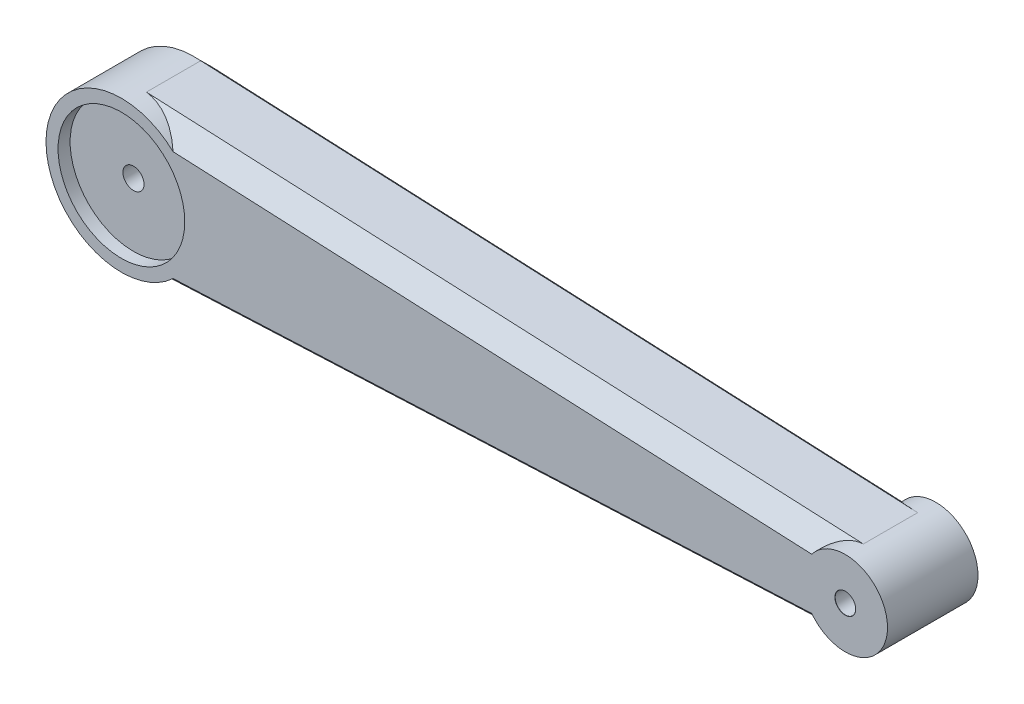
ISO-10303-21;
HEADER;
FILE_DESCRIPTION(('STEP AP214'),'2;1');
FILE_NAME('part.step','',(''),(''),'','','');
FILE_SCHEMA(('AUTOMOTIVE_DESIGN { 1 0 10303 214 1 1 1 1 }'));
ENDSEC;
DATA;
#1=APPLICATION_CONTEXT('core data for automotive mechanical design processes');
#2=APPLICATION_PROTOCOL_DEFINITION('international standard','automotive_design',2000,#1);
#3=PRODUCT_CONTEXT('',#1,'mechanical');
#4=PRODUCT('Part','Part','',(#3));
#5=PRODUCT_RELATED_PRODUCT_CATEGORY('part','',(#4));
#6=PRODUCT_DEFINITION_FORMATION('','',#4);
#7=PRODUCT_DEFINITION_CONTEXT('part definition',#1,'design');
#8=PRODUCT_DEFINITION('design','',#6,#7);
#9=PRODUCT_DEFINITION_SHAPE('','',#8);
#10=(LENGTH_UNIT() NAMED_UNIT(*) SI_UNIT(.MILLI.,.METRE.));
#11=(NAMED_UNIT(*) PLANE_ANGLE_UNIT() SI_UNIT($,.RADIAN.));
#12=(NAMED_UNIT(*) SI_UNIT($,.STERADIAN.) SOLID_ANGLE_UNIT());
#13=UNCERTAINTY_MEASURE_WITH_UNIT(LENGTH_MEASURE(1.E-05),#10,'distance_accuracy_value','');
#14=(GEOMETRIC_REPRESENTATION_CONTEXT(3) GLOBAL_UNCERTAINTY_ASSIGNED_CONTEXT((#13)) GLOBAL_UNIT_ASSIGNED_CONTEXT((#10,
#11,#12)) REPRESENTATION_CONTEXT('',''));
#15=CARTESIAN_POINT('',(0.,0.,0.));
#16=DIRECTION('',(0.,0.,1.));
#17=DIRECTION('',(1.,0.,0.));
#18=AXIS2_PLACEMENT_3D('',#15,#16,#17);
#19=CARTESIAN_POINT('',(0.,0.,15.));
#20=DIRECTION('',(0.,0.,-1.));
#21=DIRECTION('',(-1.,0.,0.));
#22=AXIS2_PLACEMENT_3D('',#19,#20,#21);
#23=CYLINDRICAL_SURFACE('',#22,12.5);
#24=CARTESIAN_POINT('',(0.,0.,15.));
#25=DIRECTION('',(0.,0.,1.));
#26=DIRECTION('',(1.,0.,0.));
#27=AXIS2_PLACEMENT_3D('',#24,#25,#26);
#28=CIRCLE('',#27,12.5);
#29=CARTESIAN_POINT('',(8.56516648559652,9.10428048085154,15.));
#30=VERTEX_POINT('',#29);
#31=CARTESIAN_POINT('',(8.56516648559648,-9.10428048085156,15.));
#32=VERTEX_POINT('',#31);
#33=EDGE_CURVE('E296',#30,#32,#28,.T.);
#34=ORIENTED_EDGE('',*,*,#33,.F.);
#35=CARTESIAN_POINT('',(0.,0.,24.4868913091261));
#36=DIRECTION('',(0.0323750735756157,0.706365241649797,0.707106781186546));
#37=DIRECTION('',(0.0323750735756155,0.706365241649794,-0.707106781186549));
#38=AXIS2_PLACEMENT_3D('',#35,#36,#37);
#39=ELLIPSE('',#38,17.6776695296637,12.5);
#40=CARTESIAN_POINT('',(1.14343133348353,12.4475927305487,12.));
#41=VERTEX_POINT('',#40);
#42=EDGE_CURVE('E52',#30,#41,#39,.T.);
#43=ORIENTED_EDGE('',*,*,#42,.T.);
#44=DIRECTION('',(0.,0.,-1.));
#45=VECTOR('',#44,1.);
#46=CARTESIAN_POINT('',(1.14343133348353,12.4475927305487,15.));
#47=LINE('',#46,#45);
#48=CARTESIAN_POINT('',(1.14343133348353,12.4475927305487,3.));
#49=VERTEX_POINT('',#48);
#50=EDGE_CURVE('E303',#41,#49,#47,.T.);
#51=ORIENTED_EDGE('',*,*,#50,.T.);
#52=CARTESIAN_POINT('',(0.,0.,3.));
#53=DIRECTION('',(0.,0.,1.));
#54=DIRECTION('',(1.,0.,0.));
#55=AXIS2_PLACEMENT_3D('',#52,#53,#54);
#56=CIRCLE('',#55,12.5);
#57=CARTESIAN_POINT('',(1.14343133348353,-12.4475927305487,3.));
#58=VERTEX_POINT('',#57);
#59=EDGE_CURVE('E149',#49,#58,#56,.T.);
#60=ORIENTED_EDGE('',*,*,#59,.T.);
#61=DIRECTION('',(0.,0.,-1.));
#62=VECTOR('',#61,1.);
#63=CARTESIAN_POINT('',(1.14343133348353,-12.4475927305487,15.));
#64=LINE('',#63,#62);
#65=CARTESIAN_POINT('',(1.14343133348353,-12.4475927305487,12.));
#66=VERTEX_POINT('',#65);
#67=EDGE_CURVE('E119',#66,#58,#64,.T.);
#68=ORIENTED_EDGE('',*,*,#67,.F.);
#69=CARTESIAN_POINT('',(0.,0.,24.4868913091262));
#70=DIRECTION('',(0.0323750735756157,-0.706365241649798,0.707106781186545));
#71=DIRECTION('',(0.0323750735756155,-0.706365241649792,-0.707106781186551));
#72=AXIS2_PLACEMENT_3D('',#69,#70,#71);
#73=ELLIPSE('',#72,17.6776695296638,12.5);
#74=EDGE_CURVE('E327',#66,#32,#73,.T.);
#75=ORIENTED_EDGE('',*,*,#74,.T.);
#76=EDGE_LOOP('',(#34,#43,#51,#60,#68,#75));
#77=FACE_BOUND('',#76,.T.);
#78=ADVANCED_FACE('F41',(#77),#23,.T.);
#79=CARTESIAN_POINT('',(1.14343133348353,-12.4475927305487,15.));
#80=DIRECTION('',(-0.0457852681334624,0.998951304730089,0.));
#81=DIRECTION('',(-0.998951304730089,-0.0457852681334624,0.));
#82=AXIS2_PLACEMENT_3D('',#79,#80,#81);
#83=PLANE('',#82);
#84=DIRECTION('',(0.,0.,-1.));
#85=VECTOR('',#84,1.);
#86=CARTESIAN_POINT('',(120.,-7.,15.));
#87=LINE('',#86,#85);
#88=CARTESIAN_POINT('',(120.,-7.,12.));
#89=VERTEX_POINT('',#88);
#90=CARTESIAN_POINT('',(120.,-7.,3.00000000000002));
#91=VERTEX_POINT('',#90);
#92=EDGE_CURVE('E108',#89,#91,#87,.T.);
#93=ORIENTED_EDGE('',*,*,#92,.F.);
#94=DIRECTION('',(-0.998951304730089,-0.0457852681334624,0.));
#95=VECTOR('',#94,1.);
#96=CARTESIAN_POINT('',(1.14343133348353,-12.4475927305487,12.));
#97=LINE('',#96,#95);
#98=EDGE_CURVE('E323',#89,#66,#97,.T.);
#99=ORIENTED_EDGE('',*,*,#98,.T.);
#100=ORIENTED_EDGE('',*,*,#67,.T.);
#101=DIRECTION('',(0.998951304730089,0.0457852681334624,0.));
#102=VECTOR('',#101,1.);
#103=CARTESIAN_POINT('',(1.14343133348353,-12.4475927305487,3.00000000000002));
#104=LINE('',#103,#102);
#105=EDGE_CURVE('E126',#58,#91,#104,.T.);
#106=ORIENTED_EDGE('',*,*,#105,.T.);
#107=EDGE_LOOP('',(#93,#99,#100,#106));
#108=FACE_BOUND('',#107,.T.);
#109=ADVANCED_FACE('F132',(#108),#83,.F.);
#110=CARTESIAN_POINT('',(120.,0.,15.));
#111=DIRECTION('',(0.,0.,-1.));
#112=DIRECTION('',(-1.,0.,0.));
#113=AXIS2_PLACEMENT_3D('',#110,#111,#112);
#114=CYLINDRICAL_SURFACE('',#113,7.);
#115=CARTESIAN_POINT('',(120.,0.,0.));
#116=DIRECTION('',(0.,0.,1.));
#117=DIRECTION('',(1.,0.,0.));
#118=AXIS2_PLACEMENT_3D('',#115,#116,#117);
#119=CIRCLE('',#118,7.);
#120=CARTESIAN_POINT('',(114.439167405954,-4.25172210533514,0.));
#121=VERTEX_POINT('',#120);
#122=CARTESIAN_POINT('',(114.439167405954,4.25172210533514,0.));
#123=VERTEX_POINT('',#122);
#124=EDGE_CURVE('E300',#121,#123,#119,.T.);
#125=ORIENTED_EDGE('',*,*,#124,.T.);
#126=CARTESIAN_POINT('',(120.,0.,-3.99265913311058));
#127=DIRECTION('',(-0.0323750735756155,-0.706365241649793,0.707106781186549));
#128=DIRECTION('',(-0.0323750735756157,-0.706365241649797,-0.707106781186546));
#129=AXIS2_PLACEMENT_3D('',#126,#127,#128);
#130=ELLIPSE('',#129,9.89949493661164,7.);
#131=CARTESIAN_POINT('',(120.,7.,3.));
#132=VERTEX_POINT('',#131);
#133=EDGE_CURVE('E129',#123,#132,#130,.F.);
#134=ORIENTED_EDGE('',*,*,#133,.T.);
#135=DIRECTION('',(0.,0.,-1.));
#136=VECTOR('',#135,1.);
#137=CARTESIAN_POINT('',(120.,7.,15.));
#138=LINE('',#137,#136);
#139=CARTESIAN_POINT('',(120.,7.,12.));
#140=VERTEX_POINT('',#139);
#141=EDGE_CURVE('E120',#140,#132,#138,.T.);
#142=ORIENTED_EDGE('',*,*,#141,.F.);
#143=CARTESIAN_POINT('',(120.,0.,18.9926591331106));
#144=DIRECTION('',(0.0323750735756157,0.706365241649797,0.707106781186546));
#145=DIRECTION('',(0.0323750735756155,0.706365241649794,-0.707106781186549));
#146=AXIS2_PLACEMENT_3D('',#143,#144,#145);
#147=ELLIPSE('',#146,9.89949493661168,7.);
#148=CARTESIAN_POINT('',(114.439167405954,4.25172210533516,15.));
#149=VERTEX_POINT('',#148);
#150=EDGE_CURVE('E11',#140,#149,#147,.T.);
#151=ORIENTED_EDGE('',*,*,#150,.T.);
#152=CARTESIAN_POINT('',(120.,0.,15.));
#153=DIRECTION('',(0.,0.,1.));
#154=DIRECTION('',(1.,0.,0.));
#155=AXIS2_PLACEMENT_3D('',#152,#153,#154);
#156=CIRCLE('',#155,7.);
#157=CARTESIAN_POINT('',(114.439167405954,-4.25172210533518,15.));
#158=VERTEX_POINT('',#157);
#159=EDGE_CURVE('E299',#158,#149,#156,.T.);
#160=ORIENTED_EDGE('',*,*,#159,.F.);
#161=CARTESIAN_POINT('',(120.,0.,18.9926591331107));
#162=DIRECTION('',(0.0323750735756157,-0.706365241649798,0.707106781186545));
#163=DIRECTION('',(0.0323750735756155,-0.706365241649792,-0.707106781186551));
#164=AXIS2_PLACEMENT_3D('',#161,#162,#163);
#165=ELLIPSE('',#164,9.8994949366117,7.);
#166=EDGE_CURVE('E114',#158,#89,#165,.T.);
#167=ORIENTED_EDGE('',*,*,#166,.T.);
#168=ORIENTED_EDGE('',*,*,#92,.T.);
#169=CARTESIAN_POINT('',(120.,0.,-3.9926591331106));
#170=DIRECTION('',(-0.0323750735756156,0.706365241649795,0.707106781186547));
#171=DIRECTION('',(-0.0323750735756156,0.706365241649795,-0.707106781186548));
#172=AXIS2_PLACEMENT_3D('',#169,#170,#171);
#173=ELLIPSE('',#172,9.89949493661167,7.);
#174=EDGE_CURVE('E111',#91,#121,#173,.F.);
#175=ORIENTED_EDGE('',*,*,#174,.T.);
#176=EDGE_LOOP('',(#125,#134,#142,#151,#160,#167,#168,#175));
#177=FACE_BOUND('',#176,.T.);
#178=ADVANCED_FACE('F110',(#177),#114,.T.);
#179=CARTESIAN_POINT('',(1.14343133348353,12.4475927305487,15.));
#180=DIRECTION('',(-0.0457852681334624,-0.998951304730089,0.));
#181=DIRECTION('',(0.998951304730089,-0.0457852681334624,0.));
#182=AXIS2_PLACEMENT_3D('',#179,#180,#181);
#183=PLANE('',#182);
#184=ORIENTED_EDGE('',*,*,#50,.F.);
#185=DIRECTION('',(0.998951304730089,-0.0457852681334624,0.));
#186=VECTOR('',#185,1.);
#187=CARTESIAN_POINT('',(120.,7.,12.));
#188=LINE('',#187,#186);
#189=EDGE_CURVE('E65',#41,#140,#188,.T.);
#190=ORIENTED_EDGE('',*,*,#189,.T.);
#191=ORIENTED_EDGE('',*,*,#141,.T.);
#192=DIRECTION('',(-0.998951304730089,0.0457852681334624,0.));
#193=VECTOR('',#192,1.);
#194=CARTESIAN_POINT('',(1.14343133348353,12.4475927305487,3.));
#195=LINE('',#194,#193);
#196=EDGE_CURVE('E130',#132,#49,#195,.T.);
#197=ORIENTED_EDGE('',*,*,#196,.T.);
#198=EDGE_LOOP('',(#184,#190,#191,#197));
#199=FACE_BOUND('',#198,.T.);
#200=ADVANCED_FACE('F220',(#199),#183,.F.);
#201=CARTESIAN_POINT('',(0.,0.,15.));
#202=DIRECTION('',(0.,0.,1.));
#203=DIRECTION('',(1.,0.,0.));
#204=AXIS2_PLACEMENT_3D('',#201,#202,#203);
#205=PLANE('',#204);
#206=CARTESIAN_POINT('',(120.,0.,15.));
#207=DIRECTION('',(0.,0.,1.));
#208=DIRECTION('',(1.,0.,0.));
#209=AXIS2_PLACEMENT_3D('',#206,#207,#208);
#210=CIRCLE('',#209,1.725);
#211=CARTESIAN_POINT('',(121.725,0.,15.));
#212=VERTEX_POINT('',#211);
#213=EDGE_CURVE('E277',#212,#212,#210,.T.);
#214=ORIENTED_EDGE('',*,*,#213,.F.);
#215=EDGE_LOOP('',(#214));
#216=FACE_BOUND('',#215,.T.);
#217=CARTESIAN_POINT('',(0.,0.,15.));
#218=DIRECTION('',(0.,0.,1.));
#219=DIRECTION('',(1.,0.,0.));
#220=AXIS2_PLACEMENT_3D('',#217,#218,#219);
#221=CIRCLE('',#220,10.5);
#222=CARTESIAN_POINT('',(10.5,0.,15.));
#223=VERTEX_POINT('',#222);
#224=EDGE_CURVE('E289',#223,#223,#221,.T.);
#225=ORIENTED_EDGE('',*,*,#224,.F.);
#226=EDGE_LOOP('',(#225));
#227=FACE_BOUND('',#226,.T.);
#228=DIRECTION('',(0.998951304730089,0.0457852681334624,0.));
#229=VECTOR('',#228,1.);
#230=CARTESIAN_POINT('',(119.8626441956,-4.00314608580976,15.));
#231=LINE('',#230,#229);
#232=EDGE_CURVE('E329',#32,#158,#231,.T.);
#233=ORIENTED_EDGE('',*,*,#232,.T.);
#234=ORIENTED_EDGE('',*,*,#159,.T.);
#235=DIRECTION('',(-0.998951304730089,0.0457852681334624,0.));
#236=VECTOR('',#235,1.);
#237=CARTESIAN_POINT('',(1.00607552908314,9.4507388163584,15.));
#238=LINE('',#237,#236);
#239=EDGE_CURVE('E158',#149,#30,#238,.T.);
#240=ORIENTED_EDGE('',*,*,#239,.T.);
#241=ORIENTED_EDGE('',*,*,#33,.T.);
#242=EDGE_LOOP('',(#233,#234,#240,#241));
#243=FACE_BOUND('',#242,.T.);
#244=ADVANCED_FACE('F223',(#216,#227,#243),#205,.T.);
#245=CARTESIAN_POINT('',(0.,0.,0.));
#246=DIRECTION('',(0.,0.,1.));
#247=DIRECTION('',(1.,0.,0.));
#248=AXIS2_PLACEMENT_3D('',#245,#246,#247);
#249=PLANE('',#248);
#250=CARTESIAN_POINT('',(0.,0.,0.));
#251=DIRECTION('',(0.,0.,-1.));
#252=DIRECTION('',(-1.,0.,0.));
#253=AXIS2_PLACEMENT_3D('',#250,#251,#252);
#254=CIRCLE('',#253,6.145);
#255=CARTESIAN_POINT('',(-6.145,0.,0.));
#256=VERTEX_POINT('',#255);
#257=EDGE_CURVE('E263',#256,#256,#254,.T.);
#258=ORIENTED_EDGE('',*,*,#257,.F.);
#259=EDGE_LOOP('',(#258));
#260=FACE_BOUND('',#259,.T.);
#261=CARTESIAN_POINT('',(120.,0.,0.));
#262=DIRECTION('',(0.,0.,1.));
#263=DIRECTION('',(1.,0.,0.));
#264=AXIS2_PLACEMENT_3D('',#261,#262,#263);
#265=CIRCLE('',#264,1.69999999999999);
#266=CARTESIAN_POINT('',(121.7,0.,0.));
#267=VERTEX_POINT('',#266);
#268=EDGE_CURVE('E285',#267,#267,#265,.T.);
#269=ORIENTED_EDGE('',*,*,#268,.T.);
#270=EDGE_LOOP('',(#269));
#271=FACE_BOUND('',#270,.T.);
#272=ORIENTED_EDGE('',*,*,#124,.F.);
#273=DIRECTION('',(-0.998951304730089,-0.0457852681334624,0.));
#274=VECTOR('',#273,1.);
#275=CARTESIAN_POINT('',(0.434359862341352,-9.47694245108405,0.));
#276=LINE('',#275,#274);
#277=CARTESIAN_POINT('',(0.932728737895797,-9.4541005442878,0.));
#278=VERTEX_POINT('',#277);
#279=EDGE_CURVE('E127',#121,#278,#276,.T.);
#280=ORIENTED_EDGE('',*,*,#279,.T.);
#281=CARTESIAN_POINT('',(0.,0.,0.));
#282=DIRECTION('',(0.,0.,1.));
#283=DIRECTION('',(1.,0.,0.));
#284=AXIS2_PLACEMENT_3D('',#281,#282,#283);
#285=CIRCLE('',#284,9.49999999999998);
#286=CARTESIAN_POINT('',(0.932728737895815,9.4541005442878,0.));
#287=VERTEX_POINT('',#286);
#288=EDGE_CURVE('E141',#278,#287,#285,.F.);
#289=ORIENTED_EDGE('',*,*,#288,.T.);
#290=DIRECTION('',(0.998951304730089,-0.0457852681334624,0.));
#291=VECTOR('',#290,1.);
#292=CARTESIAN_POINT('',(0.434359862341352,9.47694245108405,0.));
#293=LINE('',#292,#291);
#294=EDGE_CURVE('E136',#287,#123,#293,.T.);
#295=ORIENTED_EDGE('',*,*,#294,.T.);
#296=EDGE_LOOP('',(#272,#280,#289,#295));
#297=FACE_BOUND('',#296,.T.);
#298=ADVANCED_FACE('F193',(#260,#271,#297),#249,.F.);
#299=CARTESIAN_POINT('',(1.14343133348353,12.4475927305487,3.));
#300=DIRECTION('',(-0.0323750735756155,-0.706365241649793,0.707106781186549));
#301=DIRECTION('',(-0.998951304730089,0.0457852681334624,0.));
#302=AXIS2_PLACEMENT_3D('',#299,#300,#301);
#303=PLANE('',#302);
#304=ORIENTED_EDGE('',*,*,#133,.F.);
#305=ORIENTED_EDGE('',*,*,#294,.F.);
#306=CARTESIAN_POINT('',(0.932728737895815,9.4541005442878,0.));
#307=CARTESIAN_POINT('',(0.968682039138254,9.95296734663903,0.499989774632951));
#308=CARTESIAN_POINT('',(1.00421724021303,10.4518584419565,0.999984673927899));
#309=CARTESIAN_POINT('',(1.07445143866215,11.4496891707147,1.99998467392888));
#310=CARTESIAN_POINT('',(1.10915043611661,11.9486288041509,2.49998977463393));
#311=CARTESIAN_POINT('',(1.14343133348354,12.4475927305487,3.));
#312=B_SPLINE_CURVE_WITH_KNOTS('',3,(#306,#307,#308,#309,#310,#311),.UNSPECIFIED.,.F.,.F.,(4,2,
4),(0.,2.1216384643503,4.24327672539287),.UNSPECIFIED.);
#313=EDGE_CURVE('E168',#49,#287,#312,.F.);
#314=ORIENTED_EDGE('',*,*,#313,.F.);
#315=ORIENTED_EDGE('',*,*,#196,.F.);
#316=EDGE_LOOP('',(#304,#305,#314,#315));
#317=FACE_BOUND('',#316,.T.);
#318=ADVANCED_FACE('F186',(#317),#303,.F.);
#319=CARTESIAN_POINT('',(0.,0.,3.));
#320=DIRECTION('',(0.,0.,1.));
#321=DIRECTION('',(1.,0.,0.));
#322=AXIS2_PLACEMENT_3D('',#319,#320,#321);
#323=CONICAL_SURFACE('',#322,12.5,0.785398163397451);
#324=ORIENTED_EDGE('',*,*,#313,.T.);
#325=ORIENTED_EDGE('',*,*,#288,.F.);
#326=CARTESIAN_POINT('',(0.932728737895797,-9.4541005442878,0.));
#327=CARTESIAN_POINT('',(0.968682039138313,-9.95296734663903,0.499989774632952));
#328=CARTESIAN_POINT('',(1.00421724021316,-10.4518584419564,0.999984673927902));
#329=CARTESIAN_POINT('',(1.07445143866242,-11.4496891707147,1.99998467392889));
#330=CARTESIAN_POINT('',(1.10915043611694,-11.9486288041509,2.49998977463394));
#331=CARTESIAN_POINT('',(1.14343133348394,-12.4475927305486,3.00000000000001));
#332=B_SPLINE_CURVE_WITH_KNOTS('',3,(#326,#327,#328,#329,#330,#331),.UNSPECIFIED.,.F.,.F.,(4,2,
4),(0.,2.12163846435031,4.24327672539288),.UNSPECIFIED.);
#333=EDGE_CURVE('E159',#58,#278,#332,.F.);
#334=ORIENTED_EDGE('',*,*,#333,.F.);
#335=ORIENTED_EDGE('',*,*,#59,.F.);
#336=EDGE_LOOP('',(#324,#325,#334,#335));
#337=FACE_BOUND('',#336,.T.);
#338=ADVANCED_FACE('F180',(#337),#323,.T.);
#339=CARTESIAN_POINT('',(1.14343133348353,-12.4475927305487,3.00000000000002));
#340=DIRECTION('',(-0.0323750735756156,0.706365241649795,0.707106781186547));
#341=DIRECTION('',(0.998951304730089,0.0457852681334624,0.));
#342=AXIS2_PLACEMENT_3D('',#339,#340,#341);
#343=PLANE('',#342);
#344=ORIENTED_EDGE('',*,*,#333,.T.);
#345=ORIENTED_EDGE('',*,*,#279,.F.);
#346=ORIENTED_EDGE('',*,*,#174,.F.);
#347=ORIENTED_EDGE('',*,*,#105,.F.);
#348=EDGE_LOOP('',(#344,#345,#346,#347));
#349=FACE_BOUND('',#348,.T.);
#350=ADVANCED_FACE('F125',(#349),#343,.F.);
#351=CARTESIAN_POINT('',(0.,0.,13.));
#352=DIRECTION('',(0.,0.,1.));
#353=DIRECTION('',(1.,0.,0.));
#354=AXIS2_PLACEMENT_3D('',#351,#352,#353);
#355=CYLINDRICAL_SURFACE('',#354,10.5);
#356=CARTESIAN_POINT('',(0.,0.,13.));
#357=DIRECTION('',(0.,0.,1.));
#358=DIRECTION('',(1.,0.,0.));
#359=AXIS2_PLACEMENT_3D('',#356,#357,#358);
#360=CIRCLE('',#359,10.5);
#361=CARTESIAN_POINT('',(10.5,0.,13.));
#362=VERTEX_POINT('',#361);
#363=EDGE_CURVE('E169',#362,#362,#360,.T.);
#364=ORIENTED_EDGE('',*,*,#363,.F.);
#365=EDGE_LOOP('',(#364));
#366=FACE_BOUND('',#365,.T.);
#367=ORIENTED_EDGE('',*,*,#224,.T.);
#368=EDGE_LOOP('',(#367));
#369=FACE_BOUND('',#368,.T.);
#370=ADVANCED_FACE('F208',(#366,#369),#355,.F.);
#371=CARTESIAN_POINT('',(0.,0.,13.));
#372=DIRECTION('',(0.,0.,1.));
#373=DIRECTION('',(1.,0.,0.));
#374=AXIS2_PLACEMENT_3D('',#371,#372,#373);
#375=PLANE('',#374);
#376=CARTESIAN_POINT('',(0.,0.,13.));
#377=DIRECTION('',(0.,0.,1.));
#378=DIRECTION('',(1.,0.,0.));
#379=AXIS2_PLACEMENT_3D('',#376,#377,#378);
#380=CIRCLE('',#379,1.75);
#381=CARTESIAN_POINT('',(1.75,0.,13.));
#382=VERTEX_POINT('',#381);
#383=EDGE_CURVE('E46',#382,#382,#380,.T.);
#384=ORIENTED_EDGE('',*,*,#383,.F.);
#385=EDGE_LOOP('',(#384));
#386=FACE_BOUND('',#385,.T.);
#387=ORIENTED_EDGE('',*,*,#363,.T.);
#388=EDGE_LOOP('',(#387));
#389=FACE_BOUND('',#388,.T.);
#390=ADVANCED_FACE('F200',(#386,#389),#375,.T.);
#391=CARTESIAN_POINT('',(0.434359862341354,-9.47694245108409,15.));
#392=DIRECTION('',(0.0323750735756157,-0.706365241649798,0.707106781186545));
#393=DIRECTION('',(-0.998951304730089,-0.0457852681334624,0.));
#394=AXIS2_PLACEMENT_3D('',#391,#392,#393);
#395=PLANE('',#394);
#396=ORIENTED_EDGE('',*,*,#74,.F.);
#397=ORIENTED_EDGE('',*,*,#98,.F.);
#398=ORIENTED_EDGE('',*,*,#166,.F.);
#399=ORIENTED_EDGE('',*,*,#232,.F.);
#400=EDGE_LOOP('',(#396,#397,#398,#399));
#401=FACE_BOUND('',#400,.T.);
#402=ADVANCED_FACE('F196',(#401),#395,.T.);
#403=CARTESIAN_POINT('',(0.434359862341353,9.47694245108406,15.));
#404=DIRECTION('',(0.0323750735756157,0.706365241649797,0.707106781186546));
#405=DIRECTION('',(0.998951304730089,-0.0457852681334624,0.));
#406=AXIS2_PLACEMENT_3D('',#403,#404,#405);
#407=PLANE('',#406);
#408=ORIENTED_EDGE('',*,*,#150,.F.);
#409=ORIENTED_EDGE('',*,*,#189,.F.);
#410=ORIENTED_EDGE('',*,*,#42,.F.);
#411=ORIENTED_EDGE('',*,*,#239,.F.);
#412=EDGE_LOOP('',(#408,#409,#410,#411));
#413=FACE_BOUND('',#412,.T.);
#414=ADVANCED_FACE('F44',(#413),#407,.T.);
#415=CARTESIAN_POINT('',(120.,0.,15.));
#416=DIRECTION('',(0.,0.,1.));
#417=DIRECTION('',(1.,0.,0.));
#418=AXIS2_PLACEMENT_3D('',#415,#416,#417);
#419=CYLINDRICAL_SURFACE('',#418,1.69999999999999);
#420=ORIENTED_EDGE('',*,*,#268,.F.);
#421=EDGE_LOOP('',(#420));
#422=FACE_BOUND('',#421,.T.);
#423=CARTESIAN_POINT('',(120.,0.,14.975));
#424=DIRECTION('',(0.,0.,1.));
#425=DIRECTION('',(1.,0.,0.));
#426=AXIS2_PLACEMENT_3D('',#423,#424,#425);
#427=CIRCLE('',#426,1.69999999999999);
#428=CARTESIAN_POINT('',(121.7,0.,14.975));
#429=VERTEX_POINT('',#428);
#430=EDGE_CURVE('E281',#429,#429,#427,.T.);
#431=ORIENTED_EDGE('',*,*,#430,.T.);
#432=EDGE_LOOP('',(#431));
#433=FACE_BOUND('',#432,.T.);
#434=ADVANCED_FACE('F206',(#422,#433),#419,.F.);
#435=CARTESIAN_POINT('',(120.,0.,15.));
#436=DIRECTION('',(0.,0.,1.));
#437=DIRECTION('',(1.,0.,0.));
#438=AXIS2_PLACEMENT_3D('',#435,#436,#437);
#439=CONICAL_SURFACE('',#438,1.725,0.785398163397622);
#440=ORIENTED_EDGE('',*,*,#430,.F.);
#441=EDGE_LOOP('',(#440));
#442=FACE_BOUND('',#441,.T.);
#443=ORIENTED_EDGE('',*,*,#213,.T.);
#444=EDGE_LOOP('',(#443));
#445=FACE_BOUND('',#444,.T.);
#446=ADVANCED_FACE('F235',(#442,#445),#439,.F.);
#447=CARTESIAN_POINT('',(0.,0.,0.));
#448=DIRECTION('',(0.,0.,-1.));
#449=DIRECTION('',(-1.,0.,0.));
#450=AXIS2_PLACEMENT_3D('',#447,#448,#449);
#451=CYLINDRICAL_SURFACE('',#450,1.75);
#452=ORIENTED_EDGE('',*,*,#383,.T.);
#453=EDGE_LOOP('',(#452));
#454=FACE_BOUND('',#453,.T.);
#455=CARTESIAN_POINT('',(0.,0.,8.));
#456=DIRECTION('',(0.,0.,-1.));
#457=DIRECTION('',(-1.,0.,0.));
#458=AXIS2_PLACEMENT_3D('',#455,#456,#457);
#459=CIRCLE('',#458,1.75);
#460=CARTESIAN_POINT('',(-1.75,0.,8.));
#461=VERTEX_POINT('',#460);
#462=EDGE_CURVE('E273',#461,#461,#459,.T.);
#463=ORIENTED_EDGE('',*,*,#462,.T.);
#464=EDGE_LOOP('',(#463));
#465=FACE_BOUND('',#464,.T.);
#466=ADVANCED_FACE('F239',(#454,#465),#451,.F.);
#467=CARTESIAN_POINT('',(4.,0.,8.));
#468=DIRECTION('',(0.,0.,1.));
#469=DIRECTION('',(1.,0.,0.));
#470=AXIS2_PLACEMENT_3D('',#467,#468,#469);
#471=PLANE('',#470);
#472=ORIENTED_EDGE('',*,*,#462,.F.);
#473=EDGE_LOOP('',(#472));
#474=FACE_BOUND('',#473,.T.);
#475=CARTESIAN_POINT('',(0.,0.,8.));
#476=DIRECTION('',(0.,0.,-1.));
#477=DIRECTION('',(-1.,0.,0.));
#478=AXIS2_PLACEMENT_3D('',#475,#476,#477);
#479=CIRCLE('',#478,4.);
#480=CARTESIAN_POINT('',(-4.,0.,8.));
#481=VERTEX_POINT('',#480);
#482=EDGE_CURVE('E267',#481,#481,#479,.T.);
#483=ORIENTED_EDGE('',*,*,#482,.T.);
#484=EDGE_LOOP('',(#483));
#485=FACE_BOUND('',#484,.T.);
#486=ADVANCED_FACE('F243',(#474,#485),#471,.F.);
#487=CARTESIAN_POINT('',(0.,0.,0.));
#488=DIRECTION('',(0.,0.,-1.));
#489=DIRECTION('',(-1.,0.,0.));
#490=AXIS2_PLACEMENT_3D('',#487,#488,#489);
#491=CYLINDRICAL_SURFACE('',#490,4.);
#492=ORIENTED_EDGE('',*,*,#482,.F.);
#493=EDGE_LOOP('',(#492));
#494=FACE_BOUND('',#493,.T.);
#495=CARTESIAN_POINT('',(0.,0.,2.145));
#496=DIRECTION('',(0.,0.,-1.));
#497=DIRECTION('',(-1.,0.,0.));
#498=AXIS2_PLACEMENT_3D('',#495,#496,#497);
#499=CIRCLE('',#498,4.);
#500=CARTESIAN_POINT('',(-4.,0.,2.145));
#501=VERTEX_POINT('',#500);
#502=EDGE_CURVE('E260',#501,#501,#499,.T.);
#503=ORIENTED_EDGE('',*,*,#502,.T.);
#504=EDGE_LOOP('',(#503));
#505=FACE_BOUND('',#504,.T.);
#506=ADVANCED_FACE('F247',(#494,#505),#491,.F.);
#507=CARTESIAN_POINT('',(0.,0.,0.));
#508=DIRECTION('',(0.,0.,-1.));
#509=DIRECTION('',(-1.,0.,0.));
#510=AXIS2_PLACEMENT_3D('',#507,#508,#509);
#511=CONICAL_SURFACE('',#510,6.145,0.785398163397448);
#512=ORIENTED_EDGE('',*,*,#502,.F.);
#513=EDGE_LOOP('',(#512));
#514=FACE_BOUND('',#513,.T.);
#515=ORIENTED_EDGE('',*,*,#257,.T.);
#516=EDGE_LOOP('',(#515));
#517=FACE_BOUND('',#516,.T.);
#518=ADVANCED_FACE('F251',(#514,#517),#511,.F.);
#519=CLOSED_SHELL('',(#78,#109,#178,#200,#244,#298,#318,#338,#350,#370,#390,#402,#414,#434,#446,
#466,#486,#506,#518));
#520=MANIFOLD_SOLID_BREP('B2',#519);
#521=ADVANCED_BREP_SHAPE_REPRESENTATION('',(#18,#520),#14);
#522=SHAPE_DEFINITION_REPRESENTATION(#9,#521);
ENDSEC;
END-ISO-10303-21;
